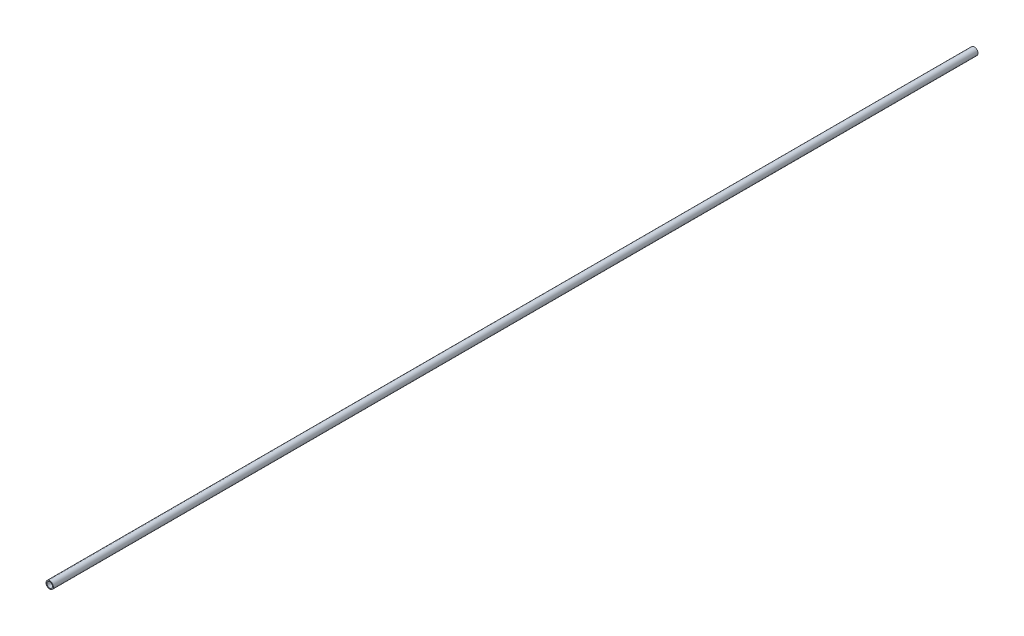
ISO-10303-21;
HEADER;
FILE_DESCRIPTION(('STEP AP214'),'2;1');
FILE_NAME('part.step','',(''),(''),'','','');
FILE_SCHEMA(('AUTOMOTIVE_DESIGN { 1 0 10303 214 1 1 1 1 }'));
ENDSEC;
DATA;
#1=APPLICATION_CONTEXT('core data for automotive mechanical design processes');
#2=APPLICATION_PROTOCOL_DEFINITION('international standard','automotive_design',2000,#1);
#3=PRODUCT_CONTEXT('',#1,'mechanical');
#4=PRODUCT('Part','Part','',(#3));
#5=PRODUCT_RELATED_PRODUCT_CATEGORY('part','',(#4));
#6=PRODUCT_DEFINITION_FORMATION('','',#4);
#7=PRODUCT_DEFINITION_CONTEXT('part definition',#1,'design');
#8=PRODUCT_DEFINITION('design','',#6,#7);
#9=PRODUCT_DEFINITION_SHAPE('','',#8);
#10=(LENGTH_UNIT() NAMED_UNIT(*) SI_UNIT(.MILLI.,.METRE.));
#11=(NAMED_UNIT(*) PLANE_ANGLE_UNIT() SI_UNIT($,.RADIAN.));
#12=(NAMED_UNIT(*) SI_UNIT($,.STERADIAN.) SOLID_ANGLE_UNIT());
#13=UNCERTAINTY_MEASURE_WITH_UNIT(LENGTH_MEASURE(1.E-05),#10,'distance_accuracy_value','');
#14=(GEOMETRIC_REPRESENTATION_CONTEXT(3) GLOBAL_UNCERTAINTY_ASSIGNED_CONTEXT((#13)) GLOBAL_UNIT_ASSIGNED_CONTEXT((#10,
#11,#12)) REPRESENTATION_CONTEXT('',''));
#15=CARTESIAN_POINT('',(0.,0.,0.));
#16=DIRECTION('',(0.,0.,1.));
#17=DIRECTION('',(1.,0.,0.));
#18=AXIS2_PLACEMENT_3D('',#15,#16,#17);
#19=CARTESIAN_POINT('',(0.,0.,500.));
#20=DIRECTION('',(0.,0.,-1.));
#21=DIRECTION('',(-1.,0.,0.));
#22=AXIS2_PLACEMENT_3D('',#19,#20,#21);
#23=CYLINDRICAL_SURFACE('',#22,4.);
#24=CARTESIAN_POINT('',(0.,0.,500.));
#25=DIRECTION('',(0.,0.,1.));
#26=DIRECTION('',(1.,0.,0.));
#27=AXIS2_PLACEMENT_3D('',#24,#25,#26);
#28=CIRCLE('',#27,4.);
#29=CARTESIAN_POINT('',(4.,0.,500.));
#30=VERTEX_POINT('',#29);
#31=EDGE_CURVE('E10',#30,#30,#28,.T.);
#32=ORIENTED_EDGE('',*,*,#31,.F.);
#33=EDGE_LOOP('',(#32));
#34=FACE_BOUND('',#33,.T.);
#35=CARTESIAN_POINT('',(0.,0.,-500.));
#36=DIRECTION('',(0.,0.,1.));
#37=DIRECTION('',(1.,0.,0.));
#38=AXIS2_PLACEMENT_3D('',#35,#36,#37);
#39=CIRCLE('',#38,4.);
#40=CARTESIAN_POINT('',(4.,0.,-500.));
#41=VERTEX_POINT('',#40);
#42=EDGE_CURVE('E46',#41,#41,#39,.T.);
#43=ORIENTED_EDGE('',*,*,#42,.T.);
#44=EDGE_LOOP('',(#43));
#45=FACE_BOUND('',#44,.T.);
#46=ADVANCED_FACE('F43',(#34,#45),#23,.T.);
#47=CARTESIAN_POINT('',(0.,0.,500.));
#48=DIRECTION('',(0.,0.,1.));
#49=DIRECTION('',(1.,0.,0.));
#50=AXIS2_PLACEMENT_3D('',#47,#48,#49);
#51=PLANE('',#50);
#52=CARTESIAN_POINT('',(0.,0.,500.));
#53=DIRECTION('',(0.,0.,1.));
#54=DIRECTION('',(1.,0.,0.));
#55=AXIS2_PLACEMENT_3D('',#52,#53,#54);
#56=CIRCLE('',#55,3.);
#57=CARTESIAN_POINT('',(3.,0.,500.));
#58=VERTEX_POINT('',#57);
#59=EDGE_CURVE('E55',#58,#58,#56,.T.);
#60=ORIENTED_EDGE('',*,*,#59,.F.);
#61=EDGE_LOOP('',(#60));
#62=FACE_BOUND('',#61,.T.);
#63=ORIENTED_EDGE('',*,*,#31,.T.);
#64=EDGE_LOOP('',(#63));
#65=FACE_BOUND('',#64,.T.);
#66=ADVANCED_FACE('F68',(#62,#65),#51,.T.);
#67=CARTESIAN_POINT('',(0.,0.,-500.));
#68=DIRECTION('',(0.,0.,1.));
#69=DIRECTION('',(1.,0.,0.));
#70=AXIS2_PLACEMENT_3D('',#67,#68,#69);
#71=PLANE('',#70);
#72=CARTESIAN_POINT('',(0.,0.,-500.));
#73=DIRECTION('',(0.,0.,1.));
#74=DIRECTION('',(1.,0.,0.));
#75=AXIS2_PLACEMENT_3D('',#72,#73,#74);
#76=CIRCLE('',#75,3.);
#77=CARTESIAN_POINT('',(3.,0.,-500.));
#78=VERTEX_POINT('',#77);
#79=EDGE_CURVE('E57',#78,#78,#76,.T.);
#80=ORIENTED_EDGE('',*,*,#79,.T.);
#81=EDGE_LOOP('',(#80));
#82=FACE_BOUND('',#81,.T.);
#83=ORIENTED_EDGE('',*,*,#42,.F.);
#84=EDGE_LOOP('',(#83));
#85=FACE_BOUND('',#84,.T.);
#86=ADVANCED_FACE('F70',(#82,#85),#71,.F.);
#87=CARTESIAN_POINT('',(0.,0.,500.));
#88=DIRECTION('',(0.,0.,-1.));
#89=DIRECTION('',(-1.,0.,0.));
#90=AXIS2_PLACEMENT_3D('',#87,#88,#89);
#91=CYLINDRICAL_SURFACE('',#90,3.);
#92=ORIENTED_EDGE('',*,*,#59,.T.);
#93=EDGE_LOOP('',(#92));
#94=FACE_BOUND('',#93,.T.);
#95=ORIENTED_EDGE('',*,*,#79,.F.);
#96=EDGE_LOOP('',(#95));
#97=FACE_BOUND('',#96,.T.);
#98=ADVANCED_FACE('F65',(#94,#97),#91,.F.);
#99=CLOSED_SHELL('',(#46,#66,#86,#98));
#100=MANIFOLD_SOLID_BREP('B2',#99);
#101=ADVANCED_BREP_SHAPE_REPRESENTATION('',(#18,#100),#14);
#102=SHAPE_DEFINITION_REPRESENTATION(#9,#101);
ENDSEC;
END-ISO-10303-21;
